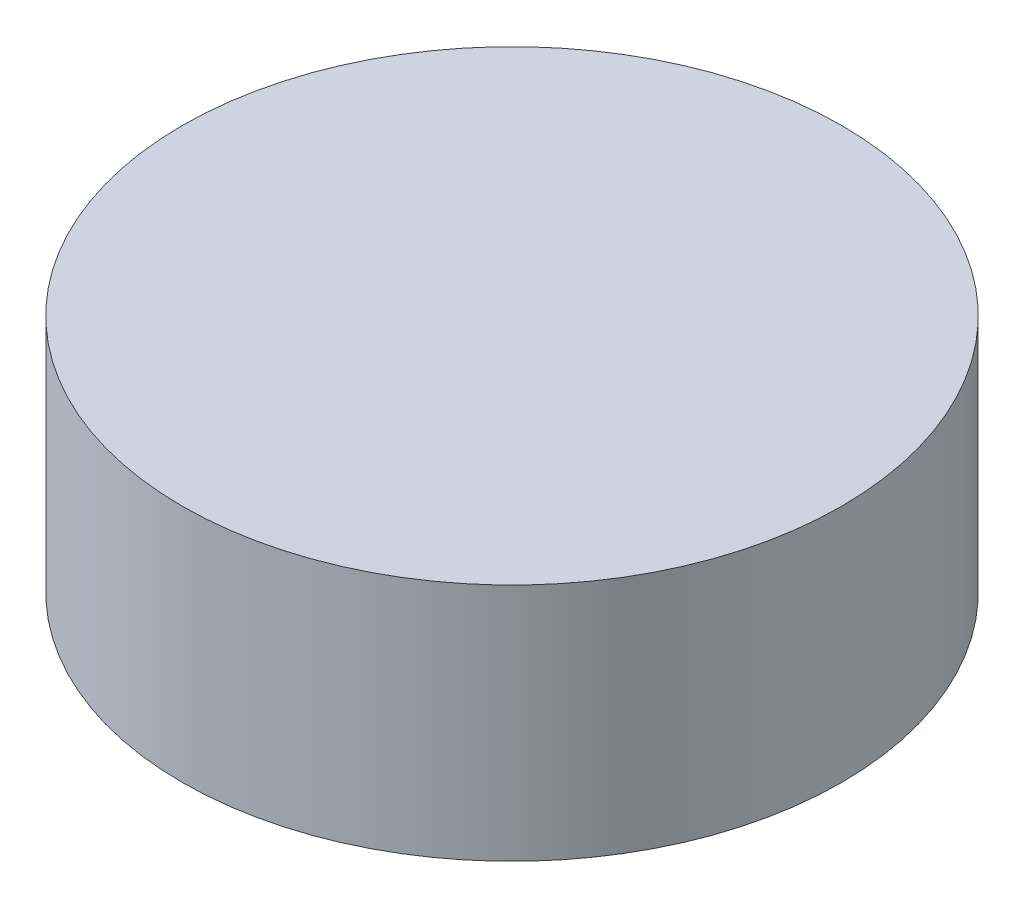
ISO-10303-21;
HEADER;
FILE_DESCRIPTION(('STEP AP214'),'2;1');
FILE_NAME('part.step','',(''),(''),'','','');
FILE_SCHEMA(('AUTOMOTIVE_DESIGN { 1 0 10303 214 1 1 1 1 }'));
ENDSEC;
DATA;
#1=APPLICATION_CONTEXT('core data for automotive mechanical design processes');
#2=APPLICATION_PROTOCOL_DEFINITION('international standard','automotive_design',2000,#1);
#3=PRODUCT_CONTEXT('',#1,'mechanical');
#4=PRODUCT('Part','Part','',(#3));
#5=PRODUCT_RELATED_PRODUCT_CATEGORY('part','',(#4));
#6=PRODUCT_DEFINITION_FORMATION('','',#4);
#7=PRODUCT_DEFINITION_CONTEXT('part definition',#1,'design');
#8=PRODUCT_DEFINITION('design','',#6,#7);
#9=PRODUCT_DEFINITION_SHAPE('','',#8);
#10=(LENGTH_UNIT() NAMED_UNIT(*) SI_UNIT(.MILLI.,.METRE.));
#11=(NAMED_UNIT(*) PLANE_ANGLE_UNIT() SI_UNIT($,.RADIAN.));
#12=(NAMED_UNIT(*) SI_UNIT($,.STERADIAN.) SOLID_ANGLE_UNIT());
#13=UNCERTAINTY_MEASURE_WITH_UNIT(LENGTH_MEASURE(1.E-05),#10,'distance_accuracy_value','');
#14=(GEOMETRIC_REPRESENTATION_CONTEXT(3) GLOBAL_UNCERTAINTY_ASSIGNED_CONTEXT((#13)) GLOBAL_UNIT_ASSIGNED_CONTEXT((#10,
#11,#12)) REPRESENTATION_CONTEXT('',''));
#15=CARTESIAN_POINT('',(0.,0.,0.));
#16=DIRECTION('',(0.,0.,1.));
#17=DIRECTION('',(1.,0.,0.));
#18=AXIS2_PLACEMENT_3D('',#15,#16,#17);
#19=CARTESIAN_POINT('',(0.,1.016,0.));
#20=DIRECTION('',(0.,-1.,0.));
#21=DIRECTION('',(0.,0.,-1.));
#22=AXIS2_PLACEMENT_3D('',#19,#20,#21);
#23=CYLINDRICAL_SURFACE('',#22,1.4);
#24=CARTESIAN_POINT('',(0.,1.016,0.));
#25=DIRECTION('',(0.,1.,0.));
#26=DIRECTION('',(0.,0.,1.));
#27=AXIS2_PLACEMENT_3D('',#24,#25,#26);
#28=CIRCLE('',#27,1.4);
#29=CARTESIAN_POINT('',(0.,1.016,1.4));
#30=VERTEX_POINT('',#29);
#31=EDGE_CURVE('E10',#30,#30,#28,.T.);
#32=ORIENTED_EDGE('',*,*,#31,.F.);
#33=EDGE_LOOP('',(#32));
#34=FACE_BOUND('',#33,.T.);
#35=CARTESIAN_POINT('',(0.,0.,0.));
#36=DIRECTION('',(0.,1.,0.));
#37=DIRECTION('',(0.,0.,1.));
#38=AXIS2_PLACEMENT_3D('',#35,#36,#37);
#39=CIRCLE('',#38,1.4);
#40=CARTESIAN_POINT('',(0.,0.,1.4));
#41=VERTEX_POINT('',#40);
#42=EDGE_CURVE('E40',#41,#41,#39,.T.);
#43=ORIENTED_EDGE('',*,*,#42,.T.);
#44=EDGE_LOOP('',(#43));
#45=FACE_BOUND('',#44,.T.);
#46=ADVANCED_FACE('F37',(#34,#45),#23,.T.);
#47=CARTESIAN_POINT('',(0.,1.016,0.));
#48=DIRECTION('',(0.,1.,0.));
#49=DIRECTION('',(0.,0.,1.));
#50=AXIS2_PLACEMENT_3D('',#47,#48,#49);
#51=PLANE('',#50);
#52=ORIENTED_EDGE('',*,*,#31,.T.);
#53=EDGE_LOOP('',(#52));
#54=FACE_BOUND('',#53,.T.);
#55=ADVANCED_FACE('F54',(#54),#51,.T.);
#56=CARTESIAN_POINT('',(0.,0.,0.));
#57=DIRECTION('',(0.,1.,0.));
#58=DIRECTION('',(0.,0.,1.));
#59=AXIS2_PLACEMENT_3D('',#56,#57,#58);
#60=PLANE('',#59);
#61=ORIENTED_EDGE('',*,*,#42,.F.);
#62=EDGE_LOOP('',(#61));
#63=FACE_BOUND('',#62,.T.);
#64=ADVANCED_FACE('F52',(#63),#60,.F.);
#65=CLOSED_SHELL('',(#46,#55,#64));
#66=MANIFOLD_SOLID_BREP('B2',#65);
#67=ADVANCED_BREP_SHAPE_REPRESENTATION('',(#18,#66),#14);
#68=SHAPE_DEFINITION_REPRESENTATION(#9,#67);
ENDSEC;
END-ISO-10303-21;
